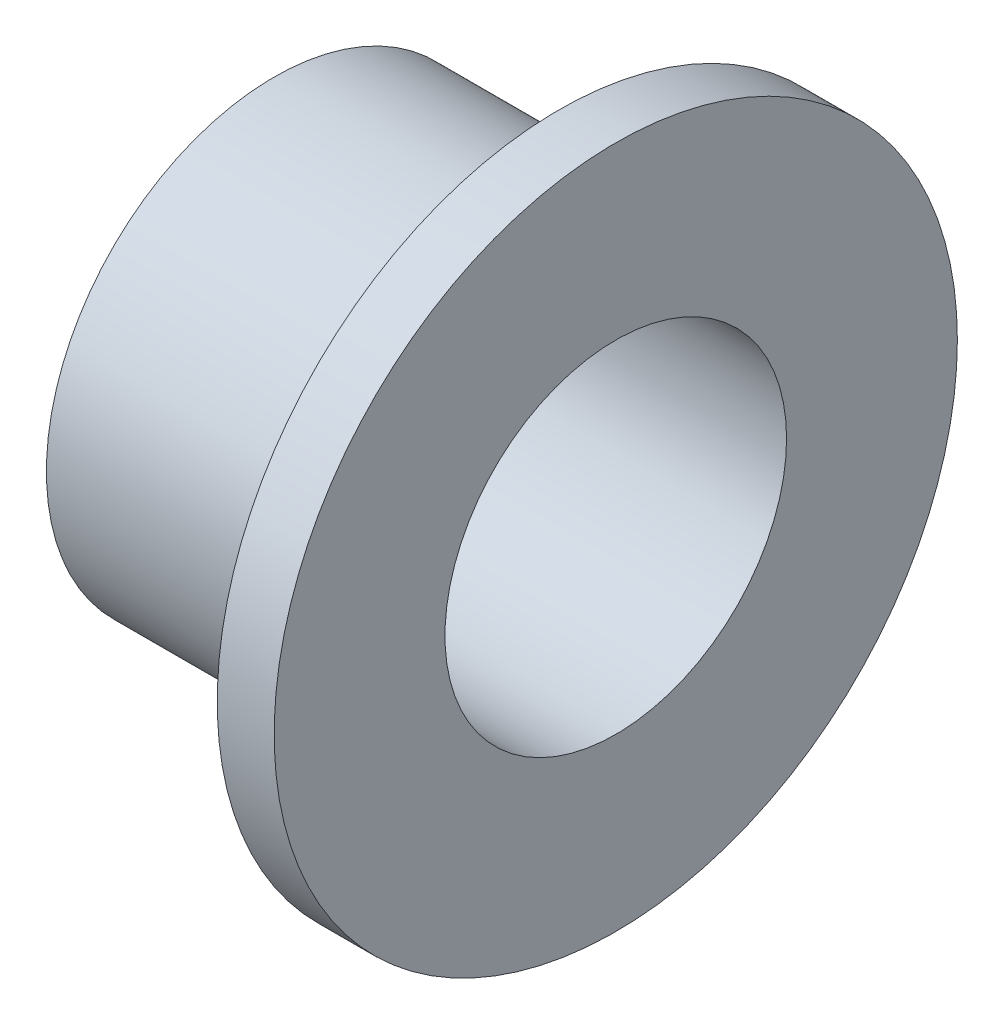
ISO-10303-21;
HEADER;
FILE_DESCRIPTION(('STEP AP214'),'2;1');
FILE_NAME('part.step','',(''),(''),'','','');
FILE_SCHEMA(('AUTOMOTIVE_DESIGN { 1 0 10303 214 1 1 1 1 }'));
ENDSEC;
DATA;
#1=APPLICATION_CONTEXT('core data for automotive mechanical design processes');
#2=APPLICATION_PROTOCOL_DEFINITION('international standard','automotive_design',2000,#1);
#3=PRODUCT_CONTEXT('',#1,'mechanical');
#4=PRODUCT('Part','Part','',(#3));
#5=PRODUCT_RELATED_PRODUCT_CATEGORY('part','',(#4));
#6=PRODUCT_DEFINITION_FORMATION('','',#4);
#7=PRODUCT_DEFINITION_CONTEXT('part definition',#1,'design');
#8=PRODUCT_DEFINITION('design','',#6,#7);
#9=PRODUCT_DEFINITION_SHAPE('','',#8);
#10=(LENGTH_UNIT() NAMED_UNIT(*) SI_UNIT(.MILLI.,.METRE.));
#11=(NAMED_UNIT(*) PLANE_ANGLE_UNIT() SI_UNIT($,.RADIAN.));
#12=(NAMED_UNIT(*) SI_UNIT($,.STERADIAN.) SOLID_ANGLE_UNIT());
#13=UNCERTAINTY_MEASURE_WITH_UNIT(LENGTH_MEASURE(1.E-05),#10,'distance_accuracy_value','');
#14=(GEOMETRIC_REPRESENTATION_CONTEXT(3) GLOBAL_UNCERTAINTY_ASSIGNED_CONTEXT((#13)) GLOBAL_UNIT_ASSIGNED_CONTEXT((#10,
#11,#12)) REPRESENTATION_CONTEXT('',''));
#15=CARTESIAN_POINT('',(0.,0.,0.));
#16=DIRECTION('',(0.,0.,1.));
#17=DIRECTION('',(1.,0.,0.));
#18=AXIS2_PLACEMENT_3D('',#15,#16,#17);
#19=CARTESIAN_POINT('',(0.,0.,0.));
#20=DIRECTION('',(1.,0.,0.));
#21=DIRECTION('',(0.,0.,-1.));
#22=AXIS2_PLACEMENT_3D('',#19,#20,#21);
#23=CYLINDRICAL_SURFACE('',#22,6.);
#24=CARTESIAN_POINT('',(0.,0.,0.));
#25=DIRECTION('',(1.,0.,0.));
#26=DIRECTION('',(0.,0.,-1.));
#27=AXIS2_PLACEMENT_3D('',#24,#25,#26);
#28=CIRCLE('',#27,6.);
#29=CARTESIAN_POINT('',(0.,0.,-6.));
#30=VERTEX_POINT('',#29);
#31=EDGE_CURVE('E10',#30,#30,#28,.T.);
#32=ORIENTED_EDGE('',*,*,#31,.F.);
#33=EDGE_LOOP('',(#32));
#34=FACE_BOUND('',#33,.T.);
#35=CARTESIAN_POINT('',(-1.,0.,0.));
#36=DIRECTION('',(1.,0.,0.));
#37=DIRECTION('',(0.,0.,-1.));
#38=AXIS2_PLACEMENT_3D('',#35,#36,#37);
#39=CIRCLE('',#38,6.);
#40=CARTESIAN_POINT('',(-1.,0.,-6.));
#41=VERTEX_POINT('',#40);
#42=EDGE_CURVE('E59',#41,#41,#39,.T.);
#43=ORIENTED_EDGE('',*,*,#42,.T.);
#44=EDGE_LOOP('',(#43));
#45=FACE_BOUND('',#44,.T.);
#46=ADVANCED_FACE('F37',(#34,#45),#23,.T.);
#47=CARTESIAN_POINT('',(0.,0.,6.));
#48=DIRECTION('',(-1.,0.,0.));
#49=DIRECTION('',(0.,0.,1.));
#50=AXIS2_PLACEMENT_3D('',#47,#48,#49);
#51=PLANE('',#50);
#52=CARTESIAN_POINT('',(0.,0.,0.));
#53=DIRECTION('',(1.,0.,0.));
#54=DIRECTION('',(0.,0.,-1.));
#55=AXIS2_PLACEMENT_3D('',#52,#53,#54);
#56=CIRCLE('',#55,3.);
#57=CARTESIAN_POINT('',(0.,0.,-3.));
#58=VERTEX_POINT('',#57);
#59=EDGE_CURVE('E43',#58,#58,#56,.T.);
#60=ORIENTED_EDGE('',*,*,#59,.F.);
#61=EDGE_LOOP('',(#60));
#62=FACE_BOUND('',#61,.T.);
#63=ORIENTED_EDGE('',*,*,#31,.T.);
#64=EDGE_LOOP('',(#63));
#65=FACE_BOUND('',#64,.T.);
#66=ADVANCED_FACE('F84',(#62,#65),#51,.F.);
#67=CARTESIAN_POINT('',(0.,0.,0.));
#68=DIRECTION('',(1.,0.,0.));
#69=DIRECTION('',(0.,0.,-1.));
#70=AXIS2_PLACEMENT_3D('',#67,#68,#69);
#71=CYLINDRICAL_SURFACE('',#70,3.);
#72=CARTESIAN_POINT('',(-6.,0.,0.));
#73=DIRECTION('',(1.,0.,0.));
#74=DIRECTION('',(0.,0.,-1.));
#75=AXIS2_PLACEMENT_3D('',#72,#73,#74);
#76=CIRCLE('',#75,3.);
#77=CARTESIAN_POINT('',(-6.,0.,-3.));
#78=VERTEX_POINT('',#77);
#79=EDGE_CURVE('E47',#78,#78,#76,.T.);
#80=ORIENTED_EDGE('',*,*,#79,.F.);
#81=EDGE_LOOP('',(#80));
#82=FACE_BOUND('',#81,.T.);
#83=ORIENTED_EDGE('',*,*,#59,.T.);
#84=EDGE_LOOP('',(#83));
#85=FACE_BOUND('',#84,.T.);
#86=ADVANCED_FACE('F79',(#82,#85),#71,.F.);
#87=CARTESIAN_POINT('',(-6.,0.,3.));
#88=DIRECTION('',(1.,0.,0.));
#89=DIRECTION('',(0.,0.,-1.));
#90=AXIS2_PLACEMENT_3D('',#87,#88,#89);
#91=PLANE('',#90);
#92=CARTESIAN_POINT('',(-6.,0.,0.));
#93=DIRECTION('',(1.,0.,0.));
#94=DIRECTION('',(0.,0.,-1.));
#95=AXIS2_PLACEMENT_3D('',#92,#93,#94);
#96=CIRCLE('',#95,4.);
#97=CARTESIAN_POINT('',(-6.,0.,-4.));
#98=VERTEX_POINT('',#97);
#99=EDGE_CURVE('E51',#98,#98,#96,.T.);
#100=ORIENTED_EDGE('',*,*,#99,.F.);
#101=EDGE_LOOP('',(#100));
#102=FACE_BOUND('',#101,.T.);
#103=ORIENTED_EDGE('',*,*,#79,.T.);
#104=EDGE_LOOP('',(#103));
#105=FACE_BOUND('',#104,.T.);
#106=ADVANCED_FACE('F73',(#102,#105),#91,.F.);
#107=CARTESIAN_POINT('',(0.,0.,0.));
#108=DIRECTION('',(1.,0.,0.));
#109=DIRECTION('',(0.,0.,-1.));
#110=AXIS2_PLACEMENT_3D('',#107,#108,#109);
#111=CYLINDRICAL_SURFACE('',#110,4.);
#112=CARTESIAN_POINT('',(-1.,0.,0.));
#113=DIRECTION('',(1.,0.,0.));
#114=DIRECTION('',(0.,0.,-1.));
#115=AXIS2_PLACEMENT_3D('',#112,#113,#114);
#116=CIRCLE('',#115,4.);
#117=CARTESIAN_POINT('',(-1.,0.,-4.));
#118=VERTEX_POINT('',#117);
#119=EDGE_CURVE('E56',#118,#118,#116,.T.);
#120=ORIENTED_EDGE('',*,*,#119,.F.);
#121=EDGE_LOOP('',(#120));
#122=FACE_BOUND('',#121,.T.);
#123=ORIENTED_EDGE('',*,*,#99,.T.);
#124=EDGE_LOOP('',(#123));
#125=FACE_BOUND('',#124,.T.);
#126=ADVANCED_FACE('F67',(#122,#125),#111,.T.);
#127=CARTESIAN_POINT('',(-1.,0.,4.));
#128=DIRECTION('',(1.,0.,0.));
#129=DIRECTION('',(0.,0.,-1.));
#130=AXIS2_PLACEMENT_3D('',#127,#128,#129);
#131=PLANE('',#130);
#132=ORIENTED_EDGE('',*,*,#42,.F.);
#133=EDGE_LOOP('',(#132));
#134=FACE_BOUND('',#133,.T.);
#135=ORIENTED_EDGE('',*,*,#119,.T.);
#136=EDGE_LOOP('',(#135));
#137=FACE_BOUND('',#136,.T.);
#138=ADVANCED_FACE('F64',(#134,#137),#131,.F.);
#139=CLOSED_SHELL('',(#46,#66,#86,#106,#126,#138));
#140=MANIFOLD_SOLID_BREP('B2',#139);
#141=ADVANCED_BREP_SHAPE_REPRESENTATION('',(#18,#140),#14);
#142=SHAPE_DEFINITION_REPRESENTATION(#9,#141);
ENDSEC;
END-ISO-10303-21;
